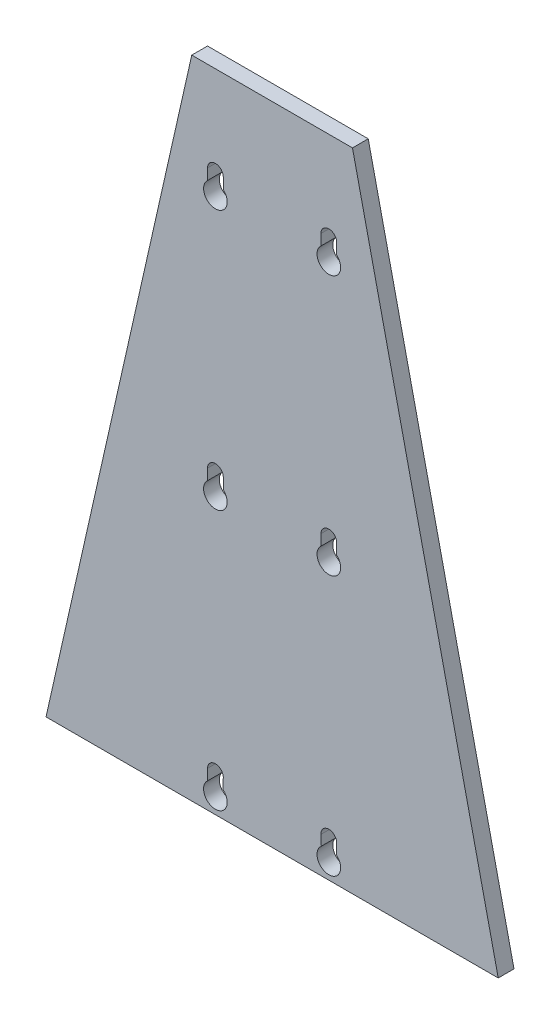
ISO-10303-21;
HEADER;
FILE_DESCRIPTION(('STEP AP214'),'2;1');
FILE_NAME('part.step','',(''),(''),'','','');
FILE_SCHEMA(('AUTOMOTIVE_DESIGN { 1 0 10303 214 1 1 1 1 }'));
ENDSEC;
DATA;
#1=APPLICATION_CONTEXT('core data for automotive mechanical design processes');
#2=APPLICATION_PROTOCOL_DEFINITION('international standard','automotive_design',2000,#1);
#3=PRODUCT_CONTEXT('',#1,'mechanical');
#4=PRODUCT('Part','Part','',(#3));
#5=PRODUCT_RELATED_PRODUCT_CATEGORY('part','',(#4));
#6=PRODUCT_DEFINITION_FORMATION('','',#4);
#7=PRODUCT_DEFINITION_CONTEXT('part definition',#1,'design');
#8=PRODUCT_DEFINITION('design','',#6,#7);
#9=PRODUCT_DEFINITION_SHAPE('','',#8);
#10=(LENGTH_UNIT() NAMED_UNIT(*) SI_UNIT(.MILLI.,.METRE.));
#11=(NAMED_UNIT(*) PLANE_ANGLE_UNIT() SI_UNIT($,.RADIAN.));
#12=(NAMED_UNIT(*) SI_UNIT($,.STERADIAN.) SOLID_ANGLE_UNIT());
#13=UNCERTAINTY_MEASURE_WITH_UNIT(LENGTH_MEASURE(1.E-05),#10,'distance_accuracy_value','');
#14=(GEOMETRIC_REPRESENTATION_CONTEXT(3) GLOBAL_UNCERTAINTY_ASSIGNED_CONTEXT((#13)) GLOBAL_UNIT_ASSIGNED_CONTEXT((#10,
#11,#12)) REPRESENTATION_CONTEXT('',''));
#15=CARTESIAN_POINT('',(0.,0.,0.));
#16=DIRECTION('',(0.,0.,1.));
#17=DIRECTION('',(1.,0.,0.));
#18=AXIS2_PLACEMENT_3D('',#15,#16,#17);
#19=CARTESIAN_POINT('',(31.,0.,10.));
#20=DIRECTION('',(1.,0.,0.));
#21=DIRECTION('',(0.,1.,0.));
#22=AXIS2_PLACEMENT_3D('',#19,#20,#21);
#23=PLANE('',#22);
#24=DIRECTION('',(0.,-1.,0.));
#25=VECTOR('',#24,1.);
#26=CARTESIAN_POINT('',(31.,0.,0.));
#27=LINE('',#26,#25);
#28=CARTESIAN_POINT('',(31.,-57.,0.));
#29=VERTEX_POINT('',#28);
#30=CARTESIAN_POINT('',(31.,-63.9098300562505,0.));
#31=VERTEX_POINT('',#30);
#32=EDGE_CURVE('E388',#29,#31,#27,.T.);
#33=ORIENTED_EDGE('',*,*,#32,.F.);
#34=DIRECTION('',(0.,0.,-1.));
#35=VECTOR('',#34,1.);
#36=CARTESIAN_POINT('',(31.,-57.,10.));
#37=LINE('',#36,#35);
#38=CARTESIAN_POINT('',(31.,-57.,10.));
#39=VERTEX_POINT('',#38);
#40=EDGE_CURVE('E11',#39,#29,#37,.T.);
#41=ORIENTED_EDGE('',*,*,#40,.F.);
#42=DIRECTION('',(0.,-1.,0.));
#43=VECTOR('',#42,1.);
#44=CARTESIAN_POINT('',(31.,0.,10.));
#45=LINE('',#44,#43);
#46=CARTESIAN_POINT('',(31.,-63.9098300562505,10.));
#47=VERTEX_POINT('',#46);
#48=EDGE_CURVE('E242',#39,#47,#45,.T.);
#49=ORIENTED_EDGE('',*,*,#48,.T.);
#50=DIRECTION('',(0.,0.,-1.));
#51=VECTOR('',#50,1.);
#52=CARTESIAN_POINT('',(31.,-63.9098300562505,10.));
#53=LINE('',#52,#51);
#54=EDGE_CURVE('E148',#47,#31,#53,.T.);
#55=ORIENTED_EDGE('',*,*,#54,.T.);
#56=EDGE_LOOP('',(#33,#41,#49,#55));
#57=FACE_BOUND('',#56,.T.);
#58=ADVANCED_FACE('F35',(#57),#23,.T.);
#59=CARTESIAN_POINT('',(36.,-57.,10.));
#60=DIRECTION('',(0.,0.,-1.));
#61=DIRECTION('',(-1.,0.,0.));
#62=AXIS2_PLACEMENT_3D('',#59,#60,#61);
#63=CYLINDRICAL_SURFACE('',#62,5.);
#64=CARTESIAN_POINT('',(36.,-57.,0.));
#65=DIRECTION('',(0.,0.,1.));
#66=DIRECTION('',(1.,0.,0.));
#67=AXIS2_PLACEMENT_3D('',#64,#65,#66);
#68=CIRCLE('',#67,5.);
#69=CARTESIAN_POINT('',(41.,-57.,0.));
#70=VERTEX_POINT('',#69);
#71=EDGE_CURVE('E247',#29,#70,#68,.F.);
#72=ORIENTED_EDGE('',*,*,#71,.T.);
#73=DIRECTION('',(0.,0.,-1.));
#74=VECTOR('',#73,1.);
#75=CARTESIAN_POINT('',(41.,-57.,10.));
#76=LINE('',#75,#74);
#77=CARTESIAN_POINT('',(41.,-57.,10.));
#78=VERTEX_POINT('',#77);
#79=EDGE_CURVE('E45',#78,#70,#76,.T.);
#80=ORIENTED_EDGE('',*,*,#79,.F.);
#81=CARTESIAN_POINT('',(36.,-57.,10.));
#82=DIRECTION('',(0.,0.,1.));
#83=DIRECTION('',(1.,0.,0.));
#84=AXIS2_PLACEMENT_3D('',#81,#82,#83);
#85=CIRCLE('',#84,5.);
#86=EDGE_CURVE('E238',#39,#78,#85,.F.);
#87=ORIENTED_EDGE('',*,*,#86,.F.);
#88=ORIENTED_EDGE('',*,*,#40,.T.);
#89=EDGE_LOOP('',(#72,#80,#87,#88));
#90=FACE_BOUND('',#89,.T.);
#91=ADVANCED_FACE('F245',(#90),#63,.F.);
#92=CARTESIAN_POINT('',(41.,0.,10.));
#93=DIRECTION('',(1.,0.,0.));
#94=DIRECTION('',(0.,0.,-1.));
#95=AXIS2_PLACEMENT_3D('',#92,#93,#94);
#96=PLANE('',#95);
#97=DIRECTION('',(0.,-1.,0.));
#98=VECTOR('',#97,1.);
#99=CARTESIAN_POINT('',(41.,0.,0.));
#100=LINE('',#99,#98);
#101=CARTESIAN_POINT('',(41.,-63.9098300562505,0.));
#102=VERTEX_POINT('',#101);
#103=EDGE_CURVE('E391',#70,#102,#100,.T.);
#104=ORIENTED_EDGE('',*,*,#103,.T.);
#105=DIRECTION('',(0.,0.,-1.));
#106=VECTOR('',#105,1.);
#107=CARTESIAN_POINT('',(41.,-63.9098300562505,10.));
#108=LINE('',#107,#106);
#109=CARTESIAN_POINT('',(41.,-63.9098300562505,10.));
#110=VERTEX_POINT('',#109);
#111=EDGE_CURVE('E237',#110,#102,#108,.T.);
#112=ORIENTED_EDGE('',*,*,#111,.F.);
#113=DIRECTION('',(0.,-1.,0.));
#114=VECTOR('',#113,1.);
#115=CARTESIAN_POINT('',(41.,0.,10.));
#116=LINE('',#115,#114);
#117=EDGE_CURVE('E231',#78,#110,#116,.T.);
#118=ORIENTED_EDGE('',*,*,#117,.F.);
#119=ORIENTED_EDGE('',*,*,#79,.T.);
#120=EDGE_LOOP('',(#104,#112,#118,#119));
#121=FACE_BOUND('',#120,.T.);
#122=ADVANCED_FACE('F234',(#121),#96,.F.);
#123=CARTESIAN_POINT('',(31.0000000000001,0.,10.));
#124=DIRECTION('',(1.,0.,0.));
#125=DIRECTION('',(0.,0.,-1.));
#126=AXIS2_PLACEMENT_3D('',#123,#124,#125);
#127=PLANE('',#126);
#128=DIRECTION('',(0.,-1.,0.));
#129=VECTOR('',#128,1.);
#130=CARTESIAN_POINT('',(31.0000000000001,0.,0.));
#131=LINE('',#130,#129);
#132=CARTESIAN_POINT('',(31.0000000000001,-222.,0.));
#133=VERTEX_POINT('',#132);
#134=CARTESIAN_POINT('',(31.0000000000001,-228.909830056251,0.));
#135=VERTEX_POINT('',#134);
#136=EDGE_CURVE('E376',#133,#135,#131,.T.);
#137=ORIENTED_EDGE('',*,*,#136,.F.);
#138=DIRECTION('',(0.,0.,-1.));
#139=VECTOR('',#138,1.);
#140=CARTESIAN_POINT('',(31.0000000000001,-222.,10.));
#141=LINE('',#140,#139);
#142=CARTESIAN_POINT('',(31.0000000000001,-222.,10.));
#143=VERTEX_POINT('',#142);
#144=EDGE_CURVE('E261',#143,#133,#141,.T.);
#145=ORIENTED_EDGE('',*,*,#144,.F.);
#146=DIRECTION('',(0.,-1.,0.));
#147=VECTOR('',#146,1.);
#148=CARTESIAN_POINT('',(31.0000000000001,0.,10.));
#149=LINE('',#148,#147);
#150=CARTESIAN_POINT('',(31.0000000000001,-228.909830056251,10.));
#151=VERTEX_POINT('',#150);
#152=EDGE_CURVE('E445',#143,#151,#149,.T.);
#153=ORIENTED_EDGE('',*,*,#152,.T.);
#154=DIRECTION('',(0.,0.,-1.));
#155=VECTOR('',#154,1.);
#156=CARTESIAN_POINT('',(31.0000000000001,-228.909830056251,10.));
#157=LINE('',#156,#155);
#158=EDGE_CURVE('E252',#151,#135,#157,.T.);
#159=ORIENTED_EDGE('',*,*,#158,.T.);
#160=EDGE_LOOP('',(#137,#145,#153,#159));
#161=FACE_BOUND('',#160,.T.);
#162=ADVANCED_FACE('F487',(#161),#127,.T.);
#163=CARTESIAN_POINT('',(36.,-222.,10.));
#164=DIRECTION('',(0.,0.,-1.));
#165=DIRECTION('',(-1.,0.,0.));
#166=AXIS2_PLACEMENT_3D('',#163,#164,#165);
#167=CYLINDRICAL_SURFACE('',#166,5.);
#168=CARTESIAN_POINT('',(36.,-222.,0.));
#169=DIRECTION('',(0.,0.,1.));
#170=DIRECTION('',(1.,0.,0.));
#171=AXIS2_PLACEMENT_3D('',#168,#169,#170);
#172=CIRCLE('',#171,5.);
#173=CARTESIAN_POINT('',(41.0000000000001,-222.,0.));
#174=VERTEX_POINT('',#173);
#175=EDGE_CURVE('E379',#133,#174,#172,.F.);
#176=ORIENTED_EDGE('',*,*,#175,.T.);
#177=DIRECTION('',(0.,0.,-1.));
#178=VECTOR('',#177,1.);
#179=CARTESIAN_POINT('',(41.0000000000001,-222.,10.));
#180=LINE('',#179,#178);
#181=CARTESIAN_POINT('',(41.0000000000001,-222.,10.));
#182=VERTEX_POINT('',#181);
#183=EDGE_CURVE('E258',#182,#174,#180,.T.);
#184=ORIENTED_EDGE('',*,*,#183,.F.);
#185=CARTESIAN_POINT('',(36.,-222.,10.));
#186=DIRECTION('',(0.,0.,1.));
#187=DIRECTION('',(1.,0.,0.));
#188=AXIS2_PLACEMENT_3D('',#185,#186,#187);
#189=CIRCLE('',#188,5.);
#190=EDGE_CURVE('E448',#143,#182,#189,.F.);
#191=ORIENTED_EDGE('',*,*,#190,.F.);
#192=ORIENTED_EDGE('',*,*,#144,.T.);
#193=EDGE_LOOP('',(#176,#184,#191,#192));
#194=FACE_BOUND('',#193,.T.);
#195=ADVANCED_FACE('F483',(#194),#167,.F.);
#196=CARTESIAN_POINT('',(41.0000000000001,0.,10.));
#197=DIRECTION('',(1.,0.,0.));
#198=DIRECTION('',(0.,0.,-1.));
#199=AXIS2_PLACEMENT_3D('',#196,#197,#198);
#200=PLANE('',#199);
#201=DIRECTION('',(0.,-1.,0.));
#202=VECTOR('',#201,1.);
#203=CARTESIAN_POINT('',(41.0000000000001,0.,0.));
#204=LINE('',#203,#202);
#205=CARTESIAN_POINT('',(41.0000000000001,-228.909830056251,0.));
#206=VERTEX_POINT('',#205);
#207=EDGE_CURVE('E382',#174,#206,#204,.T.);
#208=ORIENTED_EDGE('',*,*,#207,.T.);
#209=DIRECTION('',(0.,0.,-1.));
#210=VECTOR('',#209,1.);
#211=CARTESIAN_POINT('',(41.0000000000001,-228.909830056251,10.));
#212=LINE('',#211,#210);
#213=CARTESIAN_POINT('',(41.0000000000001,-228.909830056251,10.));
#214=VERTEX_POINT('',#213);
#215=EDGE_CURVE('E254',#214,#206,#212,.T.);
#216=ORIENTED_EDGE('',*,*,#215,.F.);
#217=DIRECTION('',(0.,-1.,0.));
#218=VECTOR('',#217,1.);
#219=CARTESIAN_POINT('',(41.0000000000001,0.,10.));
#220=LINE('',#219,#218);
#221=EDGE_CURVE('E451',#182,#214,#220,.T.);
#222=ORIENTED_EDGE('',*,*,#221,.F.);
#223=ORIENTED_EDGE('',*,*,#183,.T.);
#224=EDGE_LOOP('',(#208,#216,#222,#223));
#225=FACE_BOUND('',#224,.T.);
#226=ADVANCED_FACE('F479',(#225),#200,.F.);
#227=CARTESIAN_POINT('',(41.0000000000005,0.,10.));
#228=DIRECTION('',(1.,0.,0.));
#229=DIRECTION('',(0.,1.,0.));
#230=AXIS2_PLACEMENT_3D('',#227,#228,#229);
#231=PLANE('',#230);
#232=DIRECTION('',(0.,-1.,0.));
#233=VECTOR('',#232,1.);
#234=CARTESIAN_POINT('',(41.0000000000005,0.,0.));
#235=LINE('',#234,#233);
#236=CARTESIAN_POINT('',(41.0000000000001,-387.,0.));
#237=VERTEX_POINT('',#236);
#238=CARTESIAN_POINT('',(41.0000000000001,-393.909830056251,0.));
#239=VERTEX_POINT('',#238);
#240=EDGE_CURVE('E365',#237,#239,#235,.T.);
#241=ORIENTED_EDGE('',*,*,#240,.T.);
#242=DIRECTION('',(0.,0.,-1.));
#243=VECTOR('',#242,1.);
#244=CARTESIAN_POINT('',(41.0000000000001,-393.909830056251,10.));
#245=LINE('',#244,#243);
#246=CARTESIAN_POINT('',(41.0000000000001,-393.909830056251,10.));
#247=VERTEX_POINT('',#246);
#248=EDGE_CURVE('E255',#247,#239,#245,.T.);
#249=ORIENTED_EDGE('',*,*,#248,.F.);
#250=DIRECTION('',(0.,-1.,0.));
#251=VECTOR('',#250,1.);
#252=CARTESIAN_POINT('',(41.0000000000005,0.,10.));
#253=LINE('',#252,#251);
#254=CARTESIAN_POINT('',(41.0000000000001,-387.,10.));
#255=VERTEX_POINT('',#254);
#256=EDGE_CURVE('E435',#255,#247,#253,.T.);
#257=ORIENTED_EDGE('',*,*,#256,.F.);
#258=DIRECTION('',(0.,0.,-1.));
#259=VECTOR('',#258,1.);
#260=CARTESIAN_POINT('',(41.0000000000001,-387.,10.));
#261=LINE('',#260,#259);
#262=EDGE_CURVE('E263',#255,#237,#261,.T.);
#263=ORIENTED_EDGE('',*,*,#262,.T.);
#264=EDGE_LOOP('',(#241,#249,#257,#263));
#265=FACE_BOUND('',#264,.T.);
#266=ADVANCED_FACE('F482',(#265),#231,.F.);
#267=CARTESIAN_POINT('',(36.0000000000001,-399.5,10.));
#268=DIRECTION('',(0.,0.,-1.));
#269=DIRECTION('',(-1.,0.,0.));
#270=AXIS2_PLACEMENT_3D('',#267,#268,#269);
#271=CYLINDRICAL_SURFACE('',#270,7.50000000000002);
#272=CARTESIAN_POINT('',(36.0000000000001,-399.5,0.));
#273=DIRECTION('',(0.,0.,1.));
#274=DIRECTION('',(1.,0.,0.));
#275=AXIS2_PLACEMENT_3D('',#272,#273,#274);
#276=CIRCLE('',#275,7.50000000000002);
#277=CARTESIAN_POINT('',(31.1897541478711,-393.74573768046,0.));
#278=VERTEX_POINT('',#277);
#279=EDGE_CURVE('E368',#239,#278,#276,.F.);
#280=ORIENTED_EDGE('',*,*,#279,.T.);
#281=DIRECTION('',(0.,0.,-1.));
#282=VECTOR('',#281,1.);
#283=CARTESIAN_POINT('',(31.1897541478711,-393.74573768046,10.));
#284=LINE('',#283,#282);
#285=CARTESIAN_POINT('',(31.1897541478711,-393.74573768046,10.));
#286=VERTEX_POINT('',#285);
#287=EDGE_CURVE('E269',#286,#278,#284,.T.);
#288=ORIENTED_EDGE('',*,*,#287,.F.);
#289=CARTESIAN_POINT('',(36.0000000000001,-399.5,10.));
#290=DIRECTION('',(0.,0.,1.));
#291=DIRECTION('',(1.,0.,0.));
#292=AXIS2_PLACEMENT_3D('',#289,#290,#291);
#293=CIRCLE('',#292,7.50000000000002);
#294=EDGE_CURVE('E438',#247,#286,#293,.F.);
#295=ORIENTED_EDGE('',*,*,#294,.F.);
#296=ORIENTED_EDGE('',*,*,#248,.T.);
#297=EDGE_LOOP('',(#280,#288,#295,#296));
#298=FACE_BOUND('',#297,.T.);
#299=ADVANCED_FACE('F500',(#298),#271,.F.);
#300=CARTESIAN_POINT('',(20.0979852071029,0.565346035904268,10.));
#301=DIRECTION('',(0.999604600584097,0.0281183657261408,0.));
#302=DIRECTION('',(-0.0281183657261408,0.999604600584097,0.));
#303=AXIS2_PLACEMENT_3D('',#300,#301,#302);
#304=PLANE('',#303);
#305=DIRECTION('',(0.0281183657261408,-0.999604600584097,0.));
#306=VECTOR('',#305,1.);
#307=CARTESIAN_POINT('',(20.0979852071029,0.565346035904268,0.));
#308=LINE('',#307,#306);
#309=CARTESIAN_POINT('',(31.0079064249112,-387.281072477408,0.));
#310=VERTEX_POINT('',#309);
#311=EDGE_CURVE('E371',#310,#278,#308,.T.);
#312=ORIENTED_EDGE('',*,*,#311,.F.);
#313=DIRECTION('',(0.,0.,-1.));
#314=VECTOR('',#313,1.);
#315=CARTESIAN_POINT('',(31.0079064249112,-387.281072477408,10.));
#316=LINE('',#315,#314);
#317=CARTESIAN_POINT('',(31.0079064249112,-387.281072477408,10.));
#318=VERTEX_POINT('',#317);
#319=EDGE_CURVE('E266',#318,#310,#316,.T.);
#320=ORIENTED_EDGE('',*,*,#319,.F.);
#321=DIRECTION('',(0.0281183657261408,-0.999604600584097,0.));
#322=VECTOR('',#321,1.);
#323=CARTESIAN_POINT('',(20.0979852071029,0.565346035904268,10.));
#324=LINE('',#323,#322);
#325=EDGE_CURVE('E440',#318,#286,#324,.T.);
#326=ORIENTED_EDGE('',*,*,#325,.T.);
#327=ORIENTED_EDGE('',*,*,#287,.T.);
#328=EDGE_LOOP('',(#312,#320,#326,#327));
#329=FACE_BOUND('',#328,.T.);
#330=ADVANCED_FACE('F496',(#329),#304,.T.);
#331=CARTESIAN_POINT('',(-48.5298425614718,10.9488059437467,10.));
#332=DIRECTION('',(-0.97548220917709,0.220078303289953,0.));
#333=DIRECTION('',(-0.220078303289953,-0.97548220917709,0.));
#334=AXIS2_PLACEMENT_3D('',#331,#332,#333);
#335=PLANE('',#334);
#336=DIRECTION('',(0.220078303289953,0.97548220917709,0.));
#337=VECTOR('',#336,1.);
#338=CARTESIAN_POINT('',(-48.5298425614718,10.9488059437467,0.));
#339=LINE('',#338,#337);
#340=CARTESIAN_POINT('',(-143.5,-410.,0.));
#341=VERTEX_POINT('',#340);
#342=CARTESIAN_POINT('',(-51.,0.,0.));
#343=VERTEX_POINT('',#342);
#344=EDGE_CURVE('E353',#341,#343,#339,.T.);
#345=ORIENTED_EDGE('',*,*,#344,.F.);
#346=DIRECTION('',(0.,0.,-1.));
#347=VECTOR('',#346,1.);
#348=CARTESIAN_POINT('',(-143.5,-410.,10.));
#349=LINE('',#348,#347);
#350=CARTESIAN_POINT('',(-143.5,-410.,10.));
#351=VERTEX_POINT('',#350);
#352=EDGE_CURVE('E267',#351,#341,#349,.T.);
#353=ORIENTED_EDGE('',*,*,#352,.F.);
#354=DIRECTION('',(0.220078303289953,0.97548220917709,0.));
#355=VECTOR('',#354,1.);
#356=CARTESIAN_POINT('',(-48.5298425614718,10.9488059437467,10.));
#357=LINE('',#356,#355);
#358=CARTESIAN_POINT('',(-51.,0.,10.));
#359=VERTEX_POINT('',#358);
#360=EDGE_CURVE('E424',#351,#359,#357,.T.);
#361=ORIENTED_EDGE('',*,*,#360,.T.);
#362=DIRECTION('',(0.,0.,-1.));
#363=VECTOR('',#362,1.);
#364=CARTESIAN_POINT('',(-51.,0.,10.));
#365=LINE('',#364,#363);
#366=EDGE_CURVE('E273',#359,#343,#365,.T.);
#367=ORIENTED_EDGE('',*,*,#366,.T.);
#368=EDGE_LOOP('',(#345,#353,#361,#367));
#369=FACE_BOUND('',#368,.T.);
#370=ADVANCED_FACE('F499',(#369),#335,.T.);
#371=CARTESIAN_POINT('',(0.,-410.,10.));
#372=DIRECTION('',(0.,1.,0.));
#373=DIRECTION('',(-1.,0.,0.));
#374=AXIS2_PLACEMENT_3D('',#371,#372,#373);
#375=PLANE('',#374);
#376=DIRECTION('',(1.,0.,0.));
#377=VECTOR('',#376,1.);
#378=CARTESIAN_POINT('',(0.,-410.,0.));
#379=LINE('',#378,#377);
#380=CARTESIAN_POINT('',(143.5,-410.,0.));
#381=VERTEX_POINT('',#380);
#382=EDGE_CURVE('E356',#341,#381,#379,.T.);
#383=ORIENTED_EDGE('',*,*,#382,.T.);
#384=DIRECTION('',(0.,0.,-1.));
#385=VECTOR('',#384,1.);
#386=CARTESIAN_POINT('',(143.5,-410.,10.));
#387=LINE('',#386,#385);
#388=CARTESIAN_POINT('',(143.5,-410.,10.));
#389=VERTEX_POINT('',#388);
#390=EDGE_CURVE('E278',#389,#381,#387,.T.);
#391=ORIENTED_EDGE('',*,*,#390,.F.);
#392=DIRECTION('',(1.,0.,0.));
#393=VECTOR('',#392,1.);
#394=CARTESIAN_POINT('',(0.,-410.,10.));
#395=LINE('',#394,#393);
#396=EDGE_CURVE('E427',#351,#389,#395,.T.);
#397=ORIENTED_EDGE('',*,*,#396,.F.);
#398=ORIENTED_EDGE('',*,*,#352,.T.);
#399=EDGE_LOOP('',(#383,#391,#397,#398));
#400=FACE_BOUND('',#399,.T.);
#401=ADVANCED_FACE('F516',(#400),#375,.F.);
#402=CARTESIAN_POINT('',(48.5298425614718,10.9488059437467,10.));
#403=DIRECTION('',(-0.97548220917709,-0.220078303289953,0.));
#404=DIRECTION('',(0.220078303289953,-0.97548220917709,0.));
#405=AXIS2_PLACEMENT_3D('',#402,#403,#404);
#406=PLANE('',#405);
#407=DIRECTION('',(-0.220078303289953,0.97548220917709,0.));
#408=VECTOR('',#407,1.);
#409=CARTESIAN_POINT('',(48.5298425614718,10.9488059437467,0.));
#410=LINE('',#409,#408);
#411=CARTESIAN_POINT('',(51.,0.,0.));
#412=VERTEX_POINT('',#411);
#413=EDGE_CURVE('E359',#381,#412,#410,.T.);
#414=ORIENTED_EDGE('',*,*,#413,.T.);
#415=DIRECTION('',(0.,0.,-1.));
#416=VECTOR('',#415,1.);
#417=CARTESIAN_POINT('',(51.,0.,10.));
#418=LINE('',#417,#416);
#419=CARTESIAN_POINT('',(51.,0.,10.));
#420=VERTEX_POINT('',#419);
#421=EDGE_CURVE('E275',#420,#412,#418,.T.);
#422=ORIENTED_EDGE('',*,*,#421,.F.);
#423=DIRECTION('',(-0.220078303289953,0.97548220917709,0.));
#424=VECTOR('',#423,1.);
#425=CARTESIAN_POINT('',(48.5298425614718,10.9488059437467,10.));
#426=LINE('',#425,#424);
#427=EDGE_CURVE('E430',#389,#420,#426,.T.);
#428=ORIENTED_EDGE('',*,*,#427,.F.);
#429=ORIENTED_EDGE('',*,*,#390,.T.);
#430=EDGE_LOOP('',(#414,#422,#428,#429));
#431=FACE_BOUND('',#430,.T.);
#432=ADVANCED_FACE('F512',(#431),#406,.F.);
#433=CARTESIAN_POINT('',(-36.,-234.5,10.));
#434=DIRECTION('',(0.,0.,-1.));
#435=DIRECTION('',(-1.,0.,0.));
#436=AXIS2_PLACEMENT_3D('',#433,#434,#435);
#437=CYLINDRICAL_SURFACE('',#436,7.5);
#438=CARTESIAN_POINT('',(-36.,-234.5,0.));
#439=DIRECTION('',(0.,0.,1.));
#440=DIRECTION('',(1.,0.,0.));
#441=AXIS2_PLACEMENT_3D('',#438,#439,#440);
#442=CIRCLE('',#441,7.5);
#443=CARTESIAN_POINT('',(-41.,-228.909830056251,0.));
#444=VERTEX_POINT('',#443);
#445=CARTESIAN_POINT('',(-31.,-228.909830056251,0.));
#446=VERTEX_POINT('',#445);
#447=EDGE_CURVE('E341',#444,#446,#442,.T.);
#448=ORIENTED_EDGE('',*,*,#447,.F.);
#449=DIRECTION('',(0.,0.,-1.));
#450=VECTOR('',#449,1.);
#451=CARTESIAN_POINT('',(-41.,-228.909830056251,10.));
#452=LINE('',#451,#450);
#453=CARTESIAN_POINT('',(-41.,-228.909830056251,10.));
#454=VERTEX_POINT('',#453);
#455=EDGE_CURVE('E276',#454,#444,#452,.T.);
#456=ORIENTED_EDGE('',*,*,#455,.F.);
#457=CARTESIAN_POINT('',(-36.,-234.5,10.));
#458=DIRECTION('',(0.,0.,1.));
#459=DIRECTION('',(1.,0.,0.));
#460=AXIS2_PLACEMENT_3D('',#457,#458,#459);
#461=CIRCLE('',#460,7.5);
#462=CARTESIAN_POINT('',(-31.,-228.909830056251,10.));
#463=VERTEX_POINT('',#462);
#464=EDGE_CURVE('E413',#454,#463,#461,.T.);
#465=ORIENTED_EDGE('',*,*,#464,.T.);
#466=DIRECTION('',(0.,0.,-1.));
#467=VECTOR('',#466,1.);
#468=CARTESIAN_POINT('',(-31.,-228.909830056251,10.));
#469=LINE('',#468,#467);
#470=EDGE_CURVE('E282',#463,#446,#469,.T.);
#471=ORIENTED_EDGE('',*,*,#470,.T.);
#472=EDGE_LOOP('',(#448,#456,#465,#471));
#473=FACE_BOUND('',#472,.T.);
#474=ADVANCED_FACE('F515',(#473),#437,.F.);
#475=CARTESIAN_POINT('',(-41.,0.,10.));
#476=DIRECTION('',(1.,0.,0.));
#477=DIRECTION('',(0.,0.,-1.));
#478=AXIS2_PLACEMENT_3D('',#475,#476,#477);
#479=PLANE('',#478);
#480=DIRECTION('',(0.,-1.,0.));
#481=VECTOR('',#480,1.);
#482=CARTESIAN_POINT('',(-41.,0.,0.));
#483=LINE('',#482,#481);
#484=CARTESIAN_POINT('',(-41.,-222.,0.));
#485=VERTEX_POINT('',#484);
#486=EDGE_CURVE('E344',#485,#444,#483,.T.);
#487=ORIENTED_EDGE('',*,*,#486,.F.);
#488=DIRECTION('',(0.,0.,-1.));
#489=VECTOR('',#488,1.);
#490=CARTESIAN_POINT('',(-41.,-222.,10.));
#491=LINE('',#490,#489);
#492=CARTESIAN_POINT('',(-41.,-222.,10.));
#493=VERTEX_POINT('',#492);
#494=EDGE_CURVE('E287',#493,#485,#491,.T.);
#495=ORIENTED_EDGE('',*,*,#494,.F.);
#496=DIRECTION('',(0.,-1.,0.));
#497=VECTOR('',#496,1.);
#498=CARTESIAN_POINT('',(-41.,0.,10.));
#499=LINE('',#498,#497);
#500=EDGE_CURVE('E416',#493,#454,#499,.T.);
#501=ORIENTED_EDGE('',*,*,#500,.T.);
#502=ORIENTED_EDGE('',*,*,#455,.T.);
#503=EDGE_LOOP('',(#487,#495,#501,#502));
#504=FACE_BOUND('',#503,.T.);
#505=ADVANCED_FACE('F532',(#504),#479,.T.);
#506=CARTESIAN_POINT('',(-36.,-222.,10.));
#507=DIRECTION('',(0.,0.,-1.));
#508=DIRECTION('',(-1.,0.,0.));
#509=AXIS2_PLACEMENT_3D('',#506,#507,#508);
#510=CYLINDRICAL_SURFACE('',#509,5.);
#511=CARTESIAN_POINT('',(-36.,-222.,0.));
#512=DIRECTION('',(0.,0.,1.));
#513=DIRECTION('',(1.,0.,0.));
#514=AXIS2_PLACEMENT_3D('',#511,#512,#513);
#515=CIRCLE('',#514,5.);
#516=CARTESIAN_POINT('',(-31.,-222.,0.));
#517=VERTEX_POINT('',#516);
#518=EDGE_CURVE('E347',#517,#485,#515,.T.);
#519=ORIENTED_EDGE('',*,*,#518,.F.);
#520=DIRECTION('',(0.,0.,-1.));
#521=VECTOR('',#520,1.);
#522=CARTESIAN_POINT('',(-31.,-222.,10.));
#523=LINE('',#522,#521);
#524=CARTESIAN_POINT('',(-31.,-222.,10.));
#525=VERTEX_POINT('',#524);
#526=EDGE_CURVE('E284',#525,#517,#523,.T.);
#527=ORIENTED_EDGE('',*,*,#526,.F.);
#528=CARTESIAN_POINT('',(-36.,-222.,10.));
#529=DIRECTION('',(0.,0.,1.));
#530=DIRECTION('',(1.,0.,0.));
#531=AXIS2_PLACEMENT_3D('',#528,#529,#530);
#532=CIRCLE('',#531,5.);
#533=EDGE_CURVE('E419',#525,#493,#532,.T.);
#534=ORIENTED_EDGE('',*,*,#533,.T.);
#535=ORIENTED_EDGE('',*,*,#494,.T.);
#536=EDGE_LOOP('',(#519,#527,#534,#535));
#537=FACE_BOUND('',#536,.T.);
#538=ADVANCED_FACE('F528',(#537),#510,.F.);
#539=CARTESIAN_POINT('',(-36.,-69.5,10.));
#540=DIRECTION('',(0.,0.,-1.));
#541=DIRECTION('',(-1.,0.,0.));
#542=AXIS2_PLACEMENT_3D('',#539,#540,#541);
#543=CYLINDRICAL_SURFACE('',#542,7.5);
#544=CARTESIAN_POINT('',(-36.,-69.5,0.));
#545=DIRECTION('',(0.,0.,1.));
#546=DIRECTION('',(1.,0.,0.));
#547=AXIS2_PLACEMENT_3D('',#544,#545,#546);
#548=CIRCLE('',#547,7.5);
#549=CARTESIAN_POINT('',(-41.,-63.9098300562505,0.));
#550=VERTEX_POINT('',#549);
#551=CARTESIAN_POINT('',(-31.,-63.9098300562505,0.));
#552=VERTEX_POINT('',#551);
#553=EDGE_CURVE('E329',#550,#552,#548,.T.);
#554=ORIENTED_EDGE('',*,*,#553,.F.);
#555=DIRECTION('',(0.,0.,-1.));
#556=VECTOR('',#555,1.);
#557=CARTESIAN_POINT('',(-41.,-63.9098300562505,10.));
#558=LINE('',#557,#556);
#559=CARTESIAN_POINT('',(-41.,-63.9098300562505,10.));
#560=VERTEX_POINT('',#559);
#561=EDGE_CURVE('E285',#560,#550,#558,.T.);
#562=ORIENTED_EDGE('',*,*,#561,.F.);
#563=CARTESIAN_POINT('',(-36.,-69.5,10.));
#564=DIRECTION('',(0.,0.,1.));
#565=DIRECTION('',(1.,0.,0.));
#566=AXIS2_PLACEMENT_3D('',#563,#564,#565);
#567=CIRCLE('',#566,7.5);
#568=CARTESIAN_POINT('',(-31.,-63.9098300562505,10.));
#569=VERTEX_POINT('',#568);
#570=EDGE_CURVE('E402',#560,#569,#567,.T.);
#571=ORIENTED_EDGE('',*,*,#570,.T.);
#572=DIRECTION('',(0.,0.,-1.));
#573=VECTOR('',#572,1.);
#574=CARTESIAN_POINT('',(-31.,-63.9098300562505,10.));
#575=LINE('',#574,#573);
#576=EDGE_CURVE('E290',#569,#552,#575,.T.);
#577=ORIENTED_EDGE('',*,*,#576,.T.);
#578=EDGE_LOOP('',(#554,#562,#571,#577));
#579=FACE_BOUND('',#578,.T.);
#580=ADVANCED_FACE('F531',(#579),#543,.F.);
#581=CARTESIAN_POINT('',(-41.,0.,10.));
#582=DIRECTION('',(1.,0.,0.));
#583=DIRECTION('',(0.,0.,-1.));
#584=AXIS2_PLACEMENT_3D('',#581,#582,#583);
#585=PLANE('',#584);
#586=DIRECTION('',(0.,-1.,0.));
#587=VECTOR('',#586,1.);
#588=CARTESIAN_POINT('',(-41.,0.,0.));
#589=LINE('',#588,#587);
#590=CARTESIAN_POINT('',(-41.,-57.,0.));
#591=VERTEX_POINT('',#590);
#592=EDGE_CURVE('E332',#591,#550,#589,.T.);
#593=ORIENTED_EDGE('',*,*,#592,.F.);
#594=DIRECTION('',(0.,0.,-1.));
#595=VECTOR('',#594,1.);
#596=CARTESIAN_POINT('',(-41.,-57.,10.));
#597=LINE('',#596,#595);
#598=CARTESIAN_POINT('',(-41.,-57.,10.));
#599=VERTEX_POINT('',#598);
#600=EDGE_CURVE('E294',#599,#591,#597,.T.);
#601=ORIENTED_EDGE('',*,*,#600,.F.);
#602=DIRECTION('',(0.,-1.,0.));
#603=VECTOR('',#602,1.);
#604=CARTESIAN_POINT('',(-41.,0.,10.));
#605=LINE('',#604,#603);
#606=EDGE_CURVE('E405',#599,#560,#605,.T.);
#607=ORIENTED_EDGE('',*,*,#606,.T.);
#608=ORIENTED_EDGE('',*,*,#561,.T.);
#609=EDGE_LOOP('',(#593,#601,#607,#608));
#610=FACE_BOUND('',#609,.T.);
#611=ADVANCED_FACE('F547',(#610),#585,.T.);
#612=CARTESIAN_POINT('',(-36.,-57.,10.));
#613=DIRECTION('',(0.,0.,-1.));
#614=DIRECTION('',(-1.,0.,0.));
#615=AXIS2_PLACEMENT_3D('',#612,#613,#614);
#616=CYLINDRICAL_SURFACE('',#615,5.);
#617=CARTESIAN_POINT('',(-36.,-57.,0.));
#618=DIRECTION('',(0.,0.,1.));
#619=DIRECTION('',(1.,0.,0.));
#620=AXIS2_PLACEMENT_3D('',#617,#618,#619);
#621=CIRCLE('',#620,5.);
#622=CARTESIAN_POINT('',(-31.,-57.,0.));
#623=VERTEX_POINT('',#622);
#624=EDGE_CURVE('E335',#623,#591,#621,.T.);
#625=ORIENTED_EDGE('',*,*,#624,.F.);
#626=DIRECTION('',(0.,0.,-1.));
#627=VECTOR('',#626,1.);
#628=CARTESIAN_POINT('',(-31.,-57.,10.));
#629=LINE('',#628,#627);
#630=CARTESIAN_POINT('',(-31.,-57.,10.));
#631=VERTEX_POINT('',#630);
#632=EDGE_CURVE('E292',#631,#623,#629,.T.);
#633=ORIENTED_EDGE('',*,*,#632,.F.);
#634=CARTESIAN_POINT('',(-36.,-57.,10.));
#635=DIRECTION('',(0.,0.,1.));
#636=DIRECTION('',(1.,0.,0.));
#637=AXIS2_PLACEMENT_3D('',#634,#635,#636);
#638=CIRCLE('',#637,5.);
#639=EDGE_CURVE('E408',#631,#599,#638,.T.);
#640=ORIENTED_EDGE('',*,*,#639,.T.);
#641=ORIENTED_EDGE('',*,*,#600,.T.);
#642=EDGE_LOOP('',(#625,#633,#640,#641));
#643=FACE_BOUND('',#642,.T.);
#644=ADVANCED_FACE('F544',(#643),#616,.F.);
#645=CARTESIAN_POINT('',(-36.,-399.5,10.));
#646=DIRECTION('',(0.,0.,-1.));
#647=DIRECTION('',(-1.,0.,0.));
#648=AXIS2_PLACEMENT_3D('',#645,#646,#647);
#649=CYLINDRICAL_SURFACE('',#648,7.50000000000002);
#650=CARTESIAN_POINT('',(-36.,-399.5,0.));
#651=DIRECTION('',(0.,0.,1.));
#652=DIRECTION('',(1.,0.,0.));
#653=AXIS2_PLACEMENT_3D('',#650,#651,#652);
#654=CIRCLE('',#653,7.50000000000002);
#655=CARTESIAN_POINT('',(-41.,-393.909830056251,0.));
#656=VERTEX_POINT('',#655);
#657=CARTESIAN_POINT('',(-31.189754147871,-393.74573768046,0.));
#658=VERTEX_POINT('',#657);
#659=EDGE_CURVE('E314',#656,#658,#654,.T.);
#660=ORIENTED_EDGE('',*,*,#659,.F.);
#661=DIRECTION('',(0.,0.,-1.));
#662=VECTOR('',#661,1.);
#663=CARTESIAN_POINT('',(-41.,-393.909830056251,10.));
#664=LINE('',#663,#662);
#665=CARTESIAN_POINT('',(-41.,-393.909830056251,10.));
#666=VERTEX_POINT('',#665);
#667=EDGE_CURVE('E39',#666,#656,#664,.T.);
#668=ORIENTED_EDGE('',*,*,#667,.F.);
#669=CARTESIAN_POINT('',(-36.,-399.5,10.));
#670=DIRECTION('',(0.,0.,1.));
#671=DIRECTION('',(1.,0.,0.));
#672=AXIS2_PLACEMENT_3D('',#669,#670,#671);
#673=CIRCLE('',#672,7.50000000000002);
#674=CARTESIAN_POINT('',(-31.189754147871,-393.74573768046,10.));
#675=VERTEX_POINT('',#674);
#676=EDGE_CURVE('E393',#666,#675,#673,.T.);
#677=ORIENTED_EDGE('',*,*,#676,.T.);
#678=DIRECTION('',(0.,0.,-1.));
#679=VECTOR('',#678,1.);
#680=CARTESIAN_POINT('',(-31.189754147871,-393.74573768046,10.));
#681=LINE('',#680,#679);
#682=EDGE_CURVE('E297',#675,#658,#681,.T.);
#683=ORIENTED_EDGE('',*,*,#682,.T.);
#684=EDGE_LOOP('',(#660,#668,#677,#683));
#685=FACE_BOUND('',#684,.T.);
#686=ADVANCED_FACE('F37',(#685),#649,.F.);
#687=CARTESIAN_POINT('',(-41.0000000000004,0.,10.));
#688=DIRECTION('',(1.,0.,0.));
#689=DIRECTION('',(0.,1.,0.));
#690=AXIS2_PLACEMENT_3D('',#687,#688,#689);
#691=PLANE('',#690);
#692=DIRECTION('',(0.,-1.,0.));
#693=VECTOR('',#692,1.);
#694=CARTESIAN_POINT('',(-41.0000000000004,0.,0.));
#695=LINE('',#694,#693);
#696=CARTESIAN_POINT('',(-41.,-387.,0.));
#697=VERTEX_POINT('',#696);
#698=EDGE_CURVE('E309',#697,#656,#695,.T.);
#699=ORIENTED_EDGE('',*,*,#698,.F.);
#700=DIRECTION('',(0.,0.,-1.));
#701=VECTOR('',#700,1.);
#702=CARTESIAN_POINT('',(-41.,-387.,10.));
#703=LINE('',#702,#701);
#704=CARTESIAN_POINT('',(-41.,-387.,10.));
#705=VERTEX_POINT('',#704);
#706=EDGE_CURVE('E300',#705,#697,#703,.T.);
#707=ORIENTED_EDGE('',*,*,#706,.F.);
#708=DIRECTION('',(0.,-1.,0.));
#709=VECTOR('',#708,1.);
#710=CARTESIAN_POINT('',(-41.0000000000004,0.,10.));
#711=LINE('',#710,#709);
#712=EDGE_CURVE('E312',#705,#666,#711,.T.);
#713=ORIENTED_EDGE('',*,*,#712,.T.);
#714=ORIENTED_EDGE('',*,*,#667,.T.);
#715=EDGE_LOOP('',(#699,#707,#713,#714));
#716=FACE_BOUND('',#715,.T.);
#717=ADVANCED_FACE('F307',(#716),#691,.T.);
#718=CARTESIAN_POINT('',(-36.,-387.,10.));
#719=DIRECTION('',(0.,0.,-1.));
#720=DIRECTION('',(-1.,0.,0.));
#721=AXIS2_PLACEMENT_3D('',#718,#719,#720);
#722=CYLINDRICAL_SURFACE('',#721,5.00000000000001);
#723=CARTESIAN_POINT('',(-36.,-387.,0.));
#724=DIRECTION('',(0.,0.,1.));
#725=DIRECTION('',(1.,0.,0.));
#726=AXIS2_PLACEMENT_3D('',#723,#724,#725);
#727=CIRCLE('',#726,5.00000000000001);
#728=CARTESIAN_POINT('',(-31.0079064249111,-387.281072477408,0.));
#729=VERTEX_POINT('',#728);
#730=EDGE_CURVE('E322',#729,#697,#727,.T.);
#731=ORIENTED_EDGE('',*,*,#730,.F.);
#732=DIRECTION('',(0.,0.,-1.));
#733=VECTOR('',#732,1.);
#734=CARTESIAN_POINT('',(-31.0079064249111,-387.281072477408,10.));
#735=LINE('',#734,#733);
#736=CARTESIAN_POINT('',(-31.0079064249111,-387.281072477408,10.));
#737=VERTEX_POINT('',#736);
#738=EDGE_CURVE('E299',#737,#729,#735,.T.);
#739=ORIENTED_EDGE('',*,*,#738,.F.);
#740=CARTESIAN_POINT('',(-36.,-387.,10.));
#741=DIRECTION('',(0.,0.,1.));
#742=DIRECTION('',(1.,0.,0.));
#743=AXIS2_PLACEMENT_3D('',#740,#741,#742);
#744=CIRCLE('',#743,5.00000000000001);
#745=EDGE_CURVE('E396',#737,#705,#744,.T.);
#746=ORIENTED_EDGE('',*,*,#745,.T.);
#747=ORIENTED_EDGE('',*,*,#706,.T.);
#748=EDGE_LOOP('',(#731,#739,#746,#747));
#749=FACE_BOUND('',#748,.T.);
#750=ADVANCED_FACE('F477',(#749),#722,.F.);
#751=CARTESIAN_POINT('',(36.,-234.5,10.));
#752=DIRECTION('',(0.,0.,-1.));
#753=DIRECTION('',(-1.,0.,0.));
#754=AXIS2_PLACEMENT_3D('',#751,#752,#753);
#755=CYLINDRICAL_SURFACE('',#754,7.5);
#756=CARTESIAN_POINT('',(36.,-234.5,0.));
#757=DIRECTION('',(0.,0.,1.));
#758=DIRECTION('',(1.,0.,0.));
#759=AXIS2_PLACEMENT_3D('',#756,#757,#758);
#760=CIRCLE('',#759,7.5);
#761=EDGE_CURVE('E385',#206,#135,#760,.F.);
#762=ORIENTED_EDGE('',*,*,#761,.T.);
#763=ORIENTED_EDGE('',*,*,#158,.F.);
#764=CARTESIAN_POINT('',(36.,-234.5,10.));
#765=DIRECTION('',(0.,0.,1.));
#766=DIRECTION('',(1.,0.,0.));
#767=AXIS2_PLACEMENT_3D('',#764,#765,#766);
#768=CIRCLE('',#767,7.5);
#769=EDGE_CURVE('E454',#214,#151,#768,.F.);
#770=ORIENTED_EDGE('',*,*,#769,.F.);
#771=ORIENTED_EDGE('',*,*,#215,.T.);
#772=EDGE_LOOP('',(#762,#763,#770,#771));
#773=FACE_BOUND('',#772,.T.);
#774=ADVANCED_FACE('F473',(#773),#755,.F.);
#775=CARTESIAN_POINT('',(36.0000000000001,-387.,10.));
#776=DIRECTION('',(0.,0.,-1.));
#777=DIRECTION('',(-1.,0.,0.));
#778=AXIS2_PLACEMENT_3D('',#775,#776,#777);
#779=CYLINDRICAL_SURFACE('',#778,5.00000000000001);
#780=CARTESIAN_POINT('',(36.0000000000001,-387.,0.));
#781=DIRECTION('',(0.,0.,1.));
#782=DIRECTION('',(1.,0.,0.));
#783=AXIS2_PLACEMENT_3D('',#780,#781,#782);
#784=CIRCLE('',#783,5.00000000000001);
#785=EDGE_CURVE('E374',#310,#237,#784,.F.);
#786=ORIENTED_EDGE('',*,*,#785,.T.);
#787=ORIENTED_EDGE('',*,*,#262,.F.);
#788=CARTESIAN_POINT('',(36.0000000000001,-387.,10.));
#789=DIRECTION('',(0.,0.,1.));
#790=DIRECTION('',(1.,0.,0.));
#791=AXIS2_PLACEMENT_3D('',#788,#789,#790);
#792=CIRCLE('',#791,5.00000000000001);
#793=EDGE_CURVE('E443',#318,#255,#792,.F.);
#794=ORIENTED_EDGE('',*,*,#793,.F.);
#795=ORIENTED_EDGE('',*,*,#319,.T.);
#796=EDGE_LOOP('',(#786,#787,#794,#795));
#797=FACE_BOUND('',#796,.T.);
#798=ADVANCED_FACE('F476',(#797),#779,.F.);
#799=CARTESIAN_POINT('',(0.,0.,10.));
#800=DIRECTION('',(0.,1.,0.));
#801=DIRECTION('',(-1.,0.,0.));
#802=AXIS2_PLACEMENT_3D('',#799,#800,#801);
#803=PLANE('',#802);
#804=DIRECTION('',(1.,0.,0.));
#805=VECTOR('',#804,1.);
#806=CARTESIAN_POINT('',(0.,0.,0.));
#807=LINE('',#806,#805);
#808=EDGE_CURVE('E362',#343,#412,#807,.T.);
#809=ORIENTED_EDGE('',*,*,#808,.F.);
#810=ORIENTED_EDGE('',*,*,#366,.F.);
#811=DIRECTION('',(1.,0.,0.));
#812=VECTOR('',#811,1.);
#813=CARTESIAN_POINT('',(0.,0.,10.));
#814=LINE('',#813,#812);
#815=EDGE_CURVE('E432',#359,#420,#814,.T.);
#816=ORIENTED_EDGE('',*,*,#815,.T.);
#817=ORIENTED_EDGE('',*,*,#421,.T.);
#818=EDGE_LOOP('',(#809,#810,#816,#817));
#819=FACE_BOUND('',#818,.T.);
#820=ADVANCED_FACE('F494',(#819),#803,.T.);
#821=CARTESIAN_POINT('',(-31.,0.,10.));
#822=DIRECTION('',(1.,0.,0.));
#823=DIRECTION('',(0.,0.,-1.));
#824=AXIS2_PLACEMENT_3D('',#821,#822,#823);
#825=PLANE('',#824);
#826=DIRECTION('',(0.,-1.,0.));
#827=VECTOR('',#826,1.);
#828=CARTESIAN_POINT('',(-31.,0.,0.));
#829=LINE('',#828,#827);
#830=EDGE_CURVE('E350',#517,#446,#829,.T.);
#831=ORIENTED_EDGE('',*,*,#830,.T.);
#832=ORIENTED_EDGE('',*,*,#470,.F.);
#833=DIRECTION('',(0.,-1.,0.));
#834=VECTOR('',#833,1.);
#835=CARTESIAN_POINT('',(-31.,0.,10.));
#836=LINE('',#835,#834);
#837=EDGE_CURVE('E422',#525,#463,#836,.T.);
#838=ORIENTED_EDGE('',*,*,#837,.F.);
#839=ORIENTED_EDGE('',*,*,#526,.T.);
#840=EDGE_LOOP('',(#831,#832,#838,#839));
#841=FACE_BOUND('',#840,.T.);
#842=ADVANCED_FACE('F510',(#841),#825,.F.);
#843=CARTESIAN_POINT('',(-31.,0.,10.));
#844=DIRECTION('',(1.,0.,0.));
#845=DIRECTION('',(0.,1.,0.));
#846=AXIS2_PLACEMENT_3D('',#843,#844,#845);
#847=PLANE('',#846);
#848=DIRECTION('',(0.,-1.,0.));
#849=VECTOR('',#848,1.);
#850=CARTESIAN_POINT('',(-31.,0.,0.));
#851=LINE('',#850,#849);
#852=EDGE_CURVE('E338',#623,#552,#851,.T.);
#853=ORIENTED_EDGE('',*,*,#852,.T.);
#854=ORIENTED_EDGE('',*,*,#576,.F.);
#855=DIRECTION('',(0.,-1.,0.));
#856=VECTOR('',#855,1.);
#857=CARTESIAN_POINT('',(-31.,0.,10.));
#858=LINE('',#857,#856);
#859=EDGE_CURVE('E411',#631,#569,#858,.T.);
#860=ORIENTED_EDGE('',*,*,#859,.F.);
#861=ORIENTED_EDGE('',*,*,#632,.T.);
#862=EDGE_LOOP('',(#853,#854,#860,#861));
#863=FACE_BOUND('',#862,.T.);
#864=ADVANCED_FACE('F526',(#863),#847,.F.);
#865=CARTESIAN_POINT('',(-20.0979852071028,0.565346035904266,10.));
#866=DIRECTION('',(0.999604600584097,-0.0281183657261408,0.));
#867=DIRECTION('',(0.0281183657261408,0.999604600584097,0.));
#868=AXIS2_PLACEMENT_3D('',#865,#866,#867);
#869=PLANE('',#868);
#870=DIRECTION('',(-0.0281183657261408,-0.999604600584097,0.));
#871=VECTOR('',#870,1.);
#872=CARTESIAN_POINT('',(-20.0979852071028,0.565346035904266,0.));
#873=LINE('',#872,#871);
#874=EDGE_CURVE('E324',#729,#658,#873,.T.);
#875=ORIENTED_EDGE('',*,*,#874,.T.);
#876=ORIENTED_EDGE('',*,*,#682,.F.);
#877=DIRECTION('',(-0.0281183657261408,-0.999604600584097,0.));
#878=VECTOR('',#877,1.);
#879=CARTESIAN_POINT('',(-20.0979852071028,0.565346035904266,10.));
#880=LINE('',#879,#878);
#881=EDGE_CURVE('E400',#737,#675,#880,.T.);
#882=ORIENTED_EDGE('',*,*,#881,.F.);
#883=ORIENTED_EDGE('',*,*,#738,.T.);
#884=EDGE_LOOP('',(#875,#876,#882,#883));
#885=FACE_BOUND('',#884,.T.);
#886=ADVANCED_FACE('F542',(#885),#869,.F.);
#887=CARTESIAN_POINT('',(36.,-69.5,10.));
#888=DIRECTION('',(0.,0.,-1.));
#889=DIRECTION('',(-1.,0.,0.));
#890=AXIS2_PLACEMENT_3D('',#887,#888,#889);
#891=CYLINDRICAL_SURFACE('',#890,7.5);
#892=CARTESIAN_POINT('',(36.,-69.5,0.));
#893=DIRECTION('',(0.,0.,1.));
#894=DIRECTION('',(1.,0.,0.));
#895=AXIS2_PLACEMENT_3D('',#892,#893,#894);
#896=CIRCLE('',#895,7.5);
#897=EDGE_CURVE('E141',#102,#31,#896,.F.);
#898=ORIENTED_EDGE('',*,*,#897,.T.);
#899=ORIENTED_EDGE('',*,*,#54,.F.);
#900=CARTESIAN_POINT('',(36.,-69.5,10.));
#901=DIRECTION('',(0.,0.,1.));
#902=DIRECTION('',(1.,0.,0.));
#903=AXIS2_PLACEMENT_3D('',#900,#901,#902);
#904=CIRCLE('',#903,7.5);
#905=EDGE_CURVE('E54',#110,#47,#904,.F.);
#906=ORIENTED_EDGE('',*,*,#905,.F.);
#907=ORIENTED_EDGE('',*,*,#111,.T.);
#908=EDGE_LOOP('',(#898,#899,#906,#907));
#909=FACE_BOUND('',#908,.T.);
#910=ADVANCED_FACE('F461',(#909),#891,.F.);
#911=CARTESIAN_POINT('',(0.,0.,10.));
#912=DIRECTION('',(0.,0.,1.));
#913=DIRECTION('',(1.,0.,0.));
#914=AXIS2_PLACEMENT_3D('',#911,#912,#913);
#915=PLANE('',#914);
#916=ORIENTED_EDGE('',*,*,#676,.F.);
#917=ORIENTED_EDGE('',*,*,#712,.F.);
#918=ORIENTED_EDGE('',*,*,#745,.F.);
#919=ORIENTED_EDGE('',*,*,#881,.T.);
#920=EDGE_LOOP('',(#916,#917,#918,#919));
#921=FACE_BOUND('',#920,.T.);
#922=ORIENTED_EDGE('',*,*,#570,.F.);
#923=ORIENTED_EDGE('',*,*,#606,.F.);
#924=ORIENTED_EDGE('',*,*,#639,.F.);
#925=ORIENTED_EDGE('',*,*,#859,.T.);
#926=EDGE_LOOP('',(#922,#923,#924,#925));
#927=FACE_BOUND('',#926,.T.);
#928=ORIENTED_EDGE('',*,*,#464,.F.);
#929=ORIENTED_EDGE('',*,*,#500,.F.);
#930=ORIENTED_EDGE('',*,*,#533,.F.);
#931=ORIENTED_EDGE('',*,*,#837,.T.);
#932=EDGE_LOOP('',(#928,#929,#930,#931));
#933=FACE_BOUND('',#932,.T.);
#934=ORIENTED_EDGE('',*,*,#360,.F.);
#935=ORIENTED_EDGE('',*,*,#396,.T.);
#936=ORIENTED_EDGE('',*,*,#427,.T.);
#937=ORIENTED_EDGE('',*,*,#815,.F.);
#938=EDGE_LOOP('',(#934,#935,#936,#937));
#939=FACE_BOUND('',#938,.T.);
#940=ORIENTED_EDGE('',*,*,#256,.T.);
#941=ORIENTED_EDGE('',*,*,#294,.T.);
#942=ORIENTED_EDGE('',*,*,#325,.F.);
#943=ORIENTED_EDGE('',*,*,#793,.T.);
#944=EDGE_LOOP('',(#940,#941,#942,#943));
#945=FACE_BOUND('',#944,.T.);
#946=ORIENTED_EDGE('',*,*,#152,.F.);
#947=ORIENTED_EDGE('',*,*,#190,.T.);
#948=ORIENTED_EDGE('',*,*,#221,.T.);
#949=ORIENTED_EDGE('',*,*,#769,.T.);
#950=EDGE_LOOP('',(#946,#947,#948,#949));
#951=FACE_BOUND('',#950,.T.);
#952=ORIENTED_EDGE('',*,*,#48,.F.);
#953=ORIENTED_EDGE('',*,*,#86,.T.);
#954=ORIENTED_EDGE('',*,*,#117,.T.);
#955=ORIENTED_EDGE('',*,*,#905,.T.);
#956=EDGE_LOOP('',(#952,#953,#954,#955));
#957=FACE_BOUND('',#956,.T.);
#958=ADVANCED_FACE('F241',(#921,#927,#933,#939,#945,#951,#957),#915,.T.);
#959=CARTESIAN_POINT('',(0.,0.,0.));
#960=DIRECTION('',(0.,0.,1.));
#961=DIRECTION('',(1.,0.,0.));
#962=AXIS2_PLACEMENT_3D('',#959,#960,#961);
#963=PLANE('',#962);
#964=ORIENTED_EDGE('',*,*,#659,.T.);
#965=ORIENTED_EDGE('',*,*,#874,.F.);
#966=ORIENTED_EDGE('',*,*,#730,.T.);
#967=ORIENTED_EDGE('',*,*,#698,.T.);
#968=EDGE_LOOP('',(#964,#965,#966,#967));
#969=FACE_BOUND('',#968,.T.);
#970=ORIENTED_EDGE('',*,*,#553,.T.);
#971=ORIENTED_EDGE('',*,*,#852,.F.);
#972=ORIENTED_EDGE('',*,*,#624,.T.);
#973=ORIENTED_EDGE('',*,*,#592,.T.);
#974=EDGE_LOOP('',(#970,#971,#972,#973));
#975=FACE_BOUND('',#974,.T.);
#976=ORIENTED_EDGE('',*,*,#447,.T.);
#977=ORIENTED_EDGE('',*,*,#830,.F.);
#978=ORIENTED_EDGE('',*,*,#518,.T.);
#979=ORIENTED_EDGE('',*,*,#486,.T.);
#980=EDGE_LOOP('',(#976,#977,#978,#979));
#981=FACE_BOUND('',#980,.T.);
#982=ORIENTED_EDGE('',*,*,#344,.T.);
#983=ORIENTED_EDGE('',*,*,#808,.T.);
#984=ORIENTED_EDGE('',*,*,#413,.F.);
#985=ORIENTED_EDGE('',*,*,#382,.F.);
#986=EDGE_LOOP('',(#982,#983,#984,#985));
#987=FACE_BOUND('',#986,.T.);
#988=ORIENTED_EDGE('',*,*,#240,.F.);
#989=ORIENTED_EDGE('',*,*,#785,.F.);
#990=ORIENTED_EDGE('',*,*,#311,.T.);
#991=ORIENTED_EDGE('',*,*,#279,.F.);
#992=EDGE_LOOP('',(#988,#989,#990,#991));
#993=FACE_BOUND('',#992,.T.);
#994=ORIENTED_EDGE('',*,*,#136,.T.);
#995=ORIENTED_EDGE('',*,*,#761,.F.);
#996=ORIENTED_EDGE('',*,*,#207,.F.);
#997=ORIENTED_EDGE('',*,*,#175,.F.);
#998=EDGE_LOOP('',(#994,#995,#996,#997));
#999=FACE_BOUND('',#998,.T.);
#1000=ORIENTED_EDGE('',*,*,#32,.T.);
#1001=ORIENTED_EDGE('',*,*,#897,.F.);
#1002=ORIENTED_EDGE('',*,*,#103,.F.);
#1003=ORIENTED_EDGE('',*,*,#71,.F.);
#1004=EDGE_LOOP('',(#1000,#1001,#1002,#1003));
#1005=FACE_BOUND('',#1004,.T.);
#1006=ADVANCED_FACE('F320',(#969,#975,#981,#987,#993,#999,#1005),#963,.F.);
#1007=CLOSED_SHELL('',(#58,#91,#122,#162,#195,#226,#266,#299,#330,#370,#401,#432,#474,#505,#538,
#580,#611,#644,#686,#717,#750,#774,#798,#820,#842,#864,#886,#910,#958,#1006));
#1008=MANIFOLD_SOLID_BREP('B2',#1007);
#1009=ADVANCED_BREP_SHAPE_REPRESENTATION('',(#18,#1008),#14);
#1010=SHAPE_DEFINITION_REPRESENTATION(#9,#1009);
ENDSEC;
END-ISO-10303-21;
